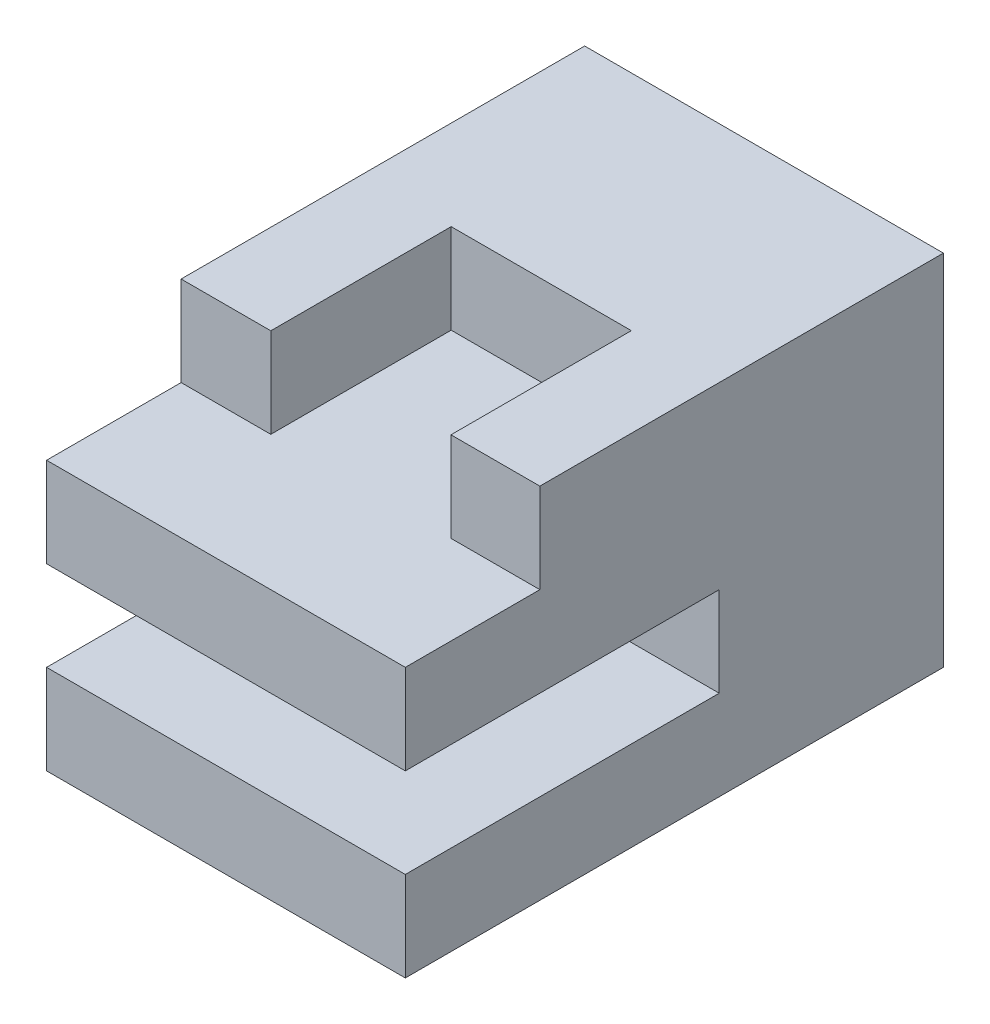
ISO-10303-21;
HEADER;
FILE_DESCRIPTION(('STEP AP214'),'2;1');
FILE_NAME('part.step','',(''),(''),'','','');
FILE_SCHEMA(('AUTOMOTIVE_DESIGN { 1 0 10303 214 1 1 1 1 }'));
ENDSEC;
DATA;
#1=APPLICATION_CONTEXT('core data for automotive mechanical design processes');
#2=APPLICATION_PROTOCOL_DEFINITION('international standard','automotive_design',2000,#1);
#3=PRODUCT_CONTEXT('',#1,'mechanical');
#4=PRODUCT('Part','Part','',(#3));
#5=PRODUCT_RELATED_PRODUCT_CATEGORY('part','',(#4));
#6=PRODUCT_DEFINITION_FORMATION('','',#4);
#7=PRODUCT_DEFINITION_CONTEXT('part definition',#1,'design');
#8=PRODUCT_DEFINITION('design','',#6,#7);
#9=PRODUCT_DEFINITION_SHAPE('','',#8);
#10=(LENGTH_UNIT() NAMED_UNIT(*) SI_UNIT(.MILLI.,.METRE.));
#11=(NAMED_UNIT(*) PLANE_ANGLE_UNIT() SI_UNIT($,.RADIAN.));
#12=(NAMED_UNIT(*) SI_UNIT($,.STERADIAN.) SOLID_ANGLE_UNIT());
#13=UNCERTAINTY_MEASURE_WITH_UNIT(LENGTH_MEASURE(1.E-05),#10,'distance_accuracy_value','');
#14=(GEOMETRIC_REPRESENTATION_CONTEXT(3) GLOBAL_UNCERTAINTY_ASSIGNED_CONTEXT((#13)) GLOBAL_UNIT_ASSIGNED_CONTEXT((#10,
#11,#12)) REPRESENTATION_CONTEXT('',''));
#15=CARTESIAN_POINT('',(0.,0.,0.));
#16=DIRECTION('',(0.,0.,1.));
#17=DIRECTION('',(1.,0.,0.));
#18=AXIS2_PLACEMENT_3D('',#15,#16,#17);
#19=CARTESIAN_POINT('',(0.,0.,45.));
#20=DIRECTION('',(0.,0.,1.));
#21=DIRECTION('',(1.,0.,0.));
#22=AXIS2_PLACEMENT_3D('',#19,#20,#21);
#23=PLANE('',#22);
#24=DIRECTION('',(0.,1.,0.));
#25=VECTOR('',#24,1.);
#26=CARTESIAN_POINT('',(10.,30.,45.));
#27=LINE('',#26,#25);
#28=CARTESIAN_POINT('',(10.,30.,45.));
#29=VERTEX_POINT('',#28);
#30=CARTESIAN_POINT('',(10.,40.,45.));
#31=VERTEX_POINT('',#30);
#32=EDGE_CURVE('E151',#29,#31,#27,.T.);
#33=ORIENTED_EDGE('',*,*,#32,.T.);
#34=DIRECTION('',(-1.,0.,0.));
#35=VECTOR('',#34,1.);
#36=CARTESIAN_POINT('',(0.,40.,45.));
#37=LINE('',#36,#35);
#38=CARTESIAN_POINT('',(0.,40.,45.));
#39=VERTEX_POINT('',#38);
#40=EDGE_CURVE('E168',#31,#39,#37,.T.);
#41=ORIENTED_EDGE('',*,*,#40,.T.);
#42=DIRECTION('',(0.,-1.,0.));
#43=VECTOR('',#42,1.);
#44=CARTESIAN_POINT('',(0.,40.,45.));
#45=LINE('',#44,#43);
#46=CARTESIAN_POINT('',(0.,30.,45.));
#47=VERTEX_POINT('',#46);
#48=EDGE_CURVE('E158',#39,#47,#45,.T.);
#49=ORIENTED_EDGE('',*,*,#48,.T.);
#50=DIRECTION('',(1.,0.,0.));
#51=VECTOR('',#50,1.);
#52=CARTESIAN_POINT('',(0.,30.,45.));
#53=LINE('',#52,#51);
#54=EDGE_CURVE('E157',#47,#29,#53,.T.);
#55=ORIENTED_EDGE('',*,*,#54,.T.);
#56=EDGE_LOOP('',(#33,#41,#49,#55));
#57=FACE_BOUND('',#56,.T.);
#58=ADVANCED_FACE('F33',(#57),#23,.T.);
#59=CARTESIAN_POINT('',(0.,40.,60.));
#60=DIRECTION('',(0.,-1.,0.));
#61=DIRECTION('',(0.,0.,-1.));
#62=AXIS2_PLACEMENT_3D('',#59,#60,#61);
#63=PLANE('',#62);
#64=ORIENTED_EDGE('',*,*,#40,.F.);
#65=DIRECTION('',(0.,0.,1.));
#66=VECTOR('',#65,1.);
#67=CARTESIAN_POINT('',(10.,40.,45.));
#68=LINE('',#67,#66);
#69=CARTESIAN_POINT('',(10.,40.,24.8859484044942));
#70=VERTEX_POINT('',#69);
#71=EDGE_CURVE('E269',#70,#31,#68,.T.);
#72=ORIENTED_EDGE('',*,*,#71,.F.);
#73=DIRECTION('',(-1.,0.,0.));
#74=VECTOR('',#73,1.);
#75=CARTESIAN_POINT('',(10.,40.,24.8859484044942));
#76=LINE('',#75,#74);
#77=CARTESIAN_POINT('',(30.0891984789241,40.,24.8859484044942));
#78=VERTEX_POINT('',#77);
#79=EDGE_CURVE('E271',#78,#70,#76,.T.);
#80=ORIENTED_EDGE('',*,*,#79,.F.);
#81=DIRECTION('',(0.,0.,-1.));
#82=VECTOR('',#81,1.);
#83=CARTESIAN_POINT('',(30.0891984789241,40.,45.));
#84=LINE('',#83,#82);
#85=CARTESIAN_POINT('',(30.0891984789241,40.,45.));
#86=VERTEX_POINT('',#85);
#87=EDGE_CURVE('E273',#86,#78,#84,.T.);
#88=ORIENTED_EDGE('',*,*,#87,.F.);
#89=CARTESIAN_POINT('',(40.,40.,45.));
#90=VERTEX_POINT('',#89);
#91=EDGE_CURVE('E150',#90,#86,#37,.T.);
#92=ORIENTED_EDGE('',*,*,#91,.F.);
#93=DIRECTION('',(0.,0.,-1.));
#94=VECTOR('',#93,1.);
#95=CARTESIAN_POINT('',(40.,40.,60.));
#96=LINE('',#95,#94);
#97=CARTESIAN_POINT('',(40.,40.,0.));
#98=VERTEX_POINT('',#97);
#99=EDGE_CURVE('E222',#90,#98,#96,.T.);
#100=ORIENTED_EDGE('',*,*,#99,.T.);
#101=DIRECTION('',(-1.,0.,0.));
#102=VECTOR('',#101,1.);
#103=CARTESIAN_POINT('',(0.,40.,0.));
#104=LINE('',#103,#102);
#105=CARTESIAN_POINT('',(0.,40.,0.));
#106=VERTEX_POINT('',#105);
#107=EDGE_CURVE('E218',#98,#106,#104,.T.);
#108=ORIENTED_EDGE('',*,*,#107,.T.);
#109=DIRECTION('',(0.,0.,-1.));
#110=VECTOR('',#109,1.);
#111=CARTESIAN_POINT('',(0.,40.,60.));
#112=LINE('',#111,#110);
#113=EDGE_CURVE('E210',#39,#106,#112,.T.);
#114=ORIENTED_EDGE('',*,*,#113,.F.);
#115=EDGE_LOOP('',(#64,#72,#80,#88,#92,#100,#108,#114));
#116=FACE_BOUND('',#115,.T.);
#117=ADVANCED_FACE('F239',(#116),#63,.F.);
#118=CARTESIAN_POINT('',(0.,0.,60.));
#119=DIRECTION('',(0.,0.,-1.));
#120=DIRECTION('',(-1.,0.,0.));
#121=AXIS2_PLACEMENT_3D('',#118,#119,#120);
#122=PLANE('',#121);
#123=DIRECTION('',(0.,1.,0.));
#124=VECTOR('',#123,1.);
#125=CARTESIAN_POINT('',(40.,0.,60.));
#126=LINE('',#125,#124);
#127=CARTESIAN_POINT('',(40.,0.,60.));
#128=VERTEX_POINT('',#127);
#129=CARTESIAN_POINT('',(40.,10.,60.));
#130=VERTEX_POINT('',#129);
#131=EDGE_CURVE('E207',#128,#130,#126,.T.);
#132=ORIENTED_EDGE('',*,*,#131,.T.);
#133=DIRECTION('',(1.,0.,0.));
#134=VECTOR('',#133,1.);
#135=CARTESIAN_POINT('',(0.,10.,60.));
#136=LINE('',#135,#134);
#137=CARTESIAN_POINT('',(0.,10.,60.));
#138=VERTEX_POINT('',#137);
#139=EDGE_CURVE('E179',#138,#130,#136,.T.);
#140=ORIENTED_EDGE('',*,*,#139,.F.);
#141=DIRECTION('',(0.,-1.,0.));
#142=VECTOR('',#141,1.);
#143=CARTESIAN_POINT('',(0.,0.,60.));
#144=LINE('',#143,#142);
#145=CARTESIAN_POINT('',(0.,0.,60.));
#146=VERTEX_POINT('',#145);
#147=EDGE_CURVE('E204',#138,#146,#144,.T.);
#148=ORIENTED_EDGE('',*,*,#147,.T.);
#149=DIRECTION('',(1.,0.,0.));
#150=VECTOR('',#149,1.);
#151=CARTESIAN_POINT('',(0.,0.,60.));
#152=LINE('',#151,#150);
#153=EDGE_CURVE('E203',#146,#128,#152,.T.);
#154=ORIENTED_EDGE('',*,*,#153,.T.);
#155=EDGE_LOOP('',(#132,#140,#148,#154));
#156=FACE_BOUND('',#155,.T.);
#157=ADVANCED_FACE('F261',(#156),#122,.F.);
#158=CARTESIAN_POINT('',(0.,0.,60.));
#159=DIRECTION('',(1.,0.,0.));
#160=DIRECTION('',(0.,0.,-1.));
#161=AXIS2_PLACEMENT_3D('',#158,#159,#160);
#162=PLANE('',#161);
#163=CARTESIAN_POINT('',(0.,30.,60.));
#164=VERTEX_POINT('',#163);
#165=CARTESIAN_POINT('',(0.,20.,60.));
#166=VERTEX_POINT('',#165);
#167=EDGE_CURVE('E201',#164,#166,#144,.T.);
#168=ORIENTED_EDGE('',*,*,#167,.F.);
#169=DIRECTION('',(0.,0.,1.));
#170=VECTOR('',#169,1.);
#171=CARTESIAN_POINT('',(0.,30.,45.));
#172=LINE('',#171,#170);
#173=EDGE_CURVE('E54',#47,#164,#172,.T.);
#174=ORIENTED_EDGE('',*,*,#173,.F.);
#175=ORIENTED_EDGE('',*,*,#48,.F.);
#176=ORIENTED_EDGE('',*,*,#113,.T.);
#177=DIRECTION('',(0.,-1.,0.));
#178=VECTOR('',#177,1.);
#179=CARTESIAN_POINT('',(0.,0.,0.));
#180=LINE('',#179,#178);
#181=CARTESIAN_POINT('',(0.,0.,0.));
#182=VERTEX_POINT('',#181);
#183=EDGE_CURVE('E194',#106,#182,#180,.T.);
#184=ORIENTED_EDGE('',*,*,#183,.T.);
#185=DIRECTION('',(0.,0.,-1.));
#186=VECTOR('',#185,1.);
#187=CARTESIAN_POINT('',(0.,0.,60.));
#188=LINE('',#187,#186);
#189=EDGE_CURVE('E11',#146,#182,#188,.T.);
#190=ORIENTED_EDGE('',*,*,#189,.F.);
#191=ORIENTED_EDGE('',*,*,#147,.F.);
#192=DIRECTION('',(0.,0.,1.));
#193=VECTOR('',#192,1.);
#194=CARTESIAN_POINT('',(0.,10.,25.));
#195=LINE('',#194,#193);
#196=CARTESIAN_POINT('',(0.,10.,25.));
#197=VERTEX_POINT('',#196);
#198=EDGE_CURVE('E195',#197,#138,#195,.T.);
#199=ORIENTED_EDGE('',*,*,#198,.F.);
#200=DIRECTION('',(0.,-1.,0.));
#201=VECTOR('',#200,1.);
#202=CARTESIAN_POINT('',(0.,10.,25.));
#203=LINE('',#202,#201);
#204=CARTESIAN_POINT('',(0.,20.,25.));
#205=VERTEX_POINT('',#204);
#206=EDGE_CURVE('E182',#205,#197,#203,.T.);
#207=ORIENTED_EDGE('',*,*,#206,.F.);
#208=DIRECTION('',(0.,0.,1.));
#209=VECTOR('',#208,1.);
#210=CARTESIAN_POINT('',(0.,20.,25.));
#211=LINE('',#210,#209);
#212=EDGE_CURVE('E197',#205,#166,#211,.T.);
#213=ORIENTED_EDGE('',*,*,#212,.T.);
#214=EDGE_LOOP('',(#168,#174,#175,#176,#184,#190,#191,#199,#207,#213));
#215=FACE_BOUND('',#214,.T.);
#216=ADVANCED_FACE('F35',(#215),#162,.F.);
#217=CARTESIAN_POINT('',(0.,0.,60.));
#218=DIRECTION('',(0.,1.,0.));
#219=DIRECTION('',(0.,0.,1.));
#220=AXIS2_PLACEMENT_3D('',#217,#218,#219);
#221=PLANE('',#220);
#222=DIRECTION('',(1.,0.,0.));
#223=VECTOR('',#222,1.);
#224=CARTESIAN_POINT('',(0.,0.,0.));
#225=LINE('',#224,#223);
#226=CARTESIAN_POINT('',(40.,0.,0.));
#227=VERTEX_POINT('',#226);
#228=EDGE_CURVE('E213',#182,#227,#225,.T.);
#229=ORIENTED_EDGE('',*,*,#228,.T.);
#230=DIRECTION('',(0.,0.,-1.));
#231=VECTOR('',#230,1.);
#232=CARTESIAN_POINT('',(40.,0.,60.));
#233=LINE('',#232,#231);
#234=EDGE_CURVE('E41',#128,#227,#233,.T.);
#235=ORIENTED_EDGE('',*,*,#234,.F.);
#236=ORIENTED_EDGE('',*,*,#153,.F.);
#237=ORIENTED_EDGE('',*,*,#189,.T.);
#238=EDGE_LOOP('',(#229,#235,#236,#237));
#239=FACE_BOUND('',#238,.T.);
#240=ADVANCED_FACE('F263',(#239),#221,.F.);
#241=CARTESIAN_POINT('',(40.,0.,60.));
#242=DIRECTION('',(-1.,0.,0.));
#243=DIRECTION('',(0.,0.,1.));
#244=AXIS2_PLACEMENT_3D('',#241,#242,#243);
#245=PLANE('',#244);
#246=DIRECTION('',(0.,1.,0.));
#247=VECTOR('',#246,1.);
#248=CARTESIAN_POINT('',(40.,40.,45.));
#249=LINE('',#248,#247);
#250=CARTESIAN_POINT('',(40.,30.,45.));
#251=VERTEX_POINT('',#250);
#252=EDGE_CURVE('E161',#251,#90,#249,.T.);
#253=ORIENTED_EDGE('',*,*,#252,.F.);
#254=DIRECTION('',(0.,0.,1.));
#255=VECTOR('',#254,1.);
#256=CARTESIAN_POINT('',(40.,30.,45.));
#257=LINE('',#256,#255);
#258=CARTESIAN_POINT('',(40.,30.,60.));
#259=VERTEX_POINT('',#258);
#260=EDGE_CURVE('E155',#251,#259,#257,.T.);
#261=ORIENTED_EDGE('',*,*,#260,.T.);
#262=CARTESIAN_POINT('',(40.,20.,60.));
#263=VERTEX_POINT('',#262);
#264=EDGE_CURVE('E206',#263,#259,#126,.T.);
#265=ORIENTED_EDGE('',*,*,#264,.F.);
#266=DIRECTION('',(0.,0.,1.));
#267=VECTOR('',#266,1.);
#268=CARTESIAN_POINT('',(40.,20.,25.));
#269=LINE('',#268,#267);
#270=CARTESIAN_POINT('',(40.,20.,25.));
#271=VERTEX_POINT('',#270);
#272=EDGE_CURVE('E187',#271,#263,#269,.T.);
#273=ORIENTED_EDGE('',*,*,#272,.F.);
#274=DIRECTION('',(0.,1.,0.));
#275=VECTOR('',#274,1.);
#276=CARTESIAN_POINT('',(40.,10.,25.));
#277=LINE('',#276,#275);
#278=CARTESIAN_POINT('',(40.,10.,25.));
#279=VERTEX_POINT('',#278);
#280=EDGE_CURVE('E175',#279,#271,#277,.T.);
#281=ORIENTED_EDGE('',*,*,#280,.F.);
#282=DIRECTION('',(0.,0.,1.));
#283=VECTOR('',#282,1.);
#284=CARTESIAN_POINT('',(40.,10.,25.));
#285=LINE('',#284,#283);
#286=EDGE_CURVE('E191',#279,#130,#285,.T.);
#287=ORIENTED_EDGE('',*,*,#286,.T.);
#288=ORIENTED_EDGE('',*,*,#131,.F.);
#289=ORIENTED_EDGE('',*,*,#234,.T.);
#290=DIRECTION('',(0.,1.,0.));
#291=VECTOR('',#290,1.);
#292=CARTESIAN_POINT('',(40.,0.,0.));
#293=LINE('',#292,#291);
#294=EDGE_CURVE('E215',#227,#98,#293,.T.);
#295=ORIENTED_EDGE('',*,*,#294,.T.);
#296=ORIENTED_EDGE('',*,*,#99,.F.);
#297=EDGE_LOOP('',(#253,#261,#265,#273,#281,#287,#288,#289,#295,#296));
#298=FACE_BOUND('',#297,.T.);
#299=ADVANCED_FACE('F228',(#298),#245,.F.);
#300=ORIENTED_EDGE('',*,*,#264,.T.);
#301=DIRECTION('',(1.,0.,0.));
#302=VECTOR('',#301,1.);
#303=CARTESIAN_POINT('',(0.,30.,60.));
#304=LINE('',#303,#302);
#305=EDGE_CURVE('E163',#164,#259,#304,.T.);
#306=ORIENTED_EDGE('',*,*,#305,.F.);
#307=ORIENTED_EDGE('',*,*,#167,.T.);
#308=DIRECTION('',(-1.,0.,0.));
#309=VECTOR('',#308,1.);
#310=CARTESIAN_POINT('',(0.,20.,60.));
#311=LINE('',#310,#309);
#312=EDGE_CURVE('E173',#263,#166,#311,.T.);
#313=ORIENTED_EDGE('',*,*,#312,.F.);
#314=EDGE_LOOP('',(#300,#306,#307,#313));
#315=FACE_BOUND('',#314,.T.);
#316=ADVANCED_FACE('F245',(#315),#122,.F.);
#317=CARTESIAN_POINT('',(0.,0.,0.));
#318=DIRECTION('',(0.,0.,-1.));
#319=DIRECTION('',(-1.,0.,0.));
#320=AXIS2_PLACEMENT_3D('',#317,#318,#319);
#321=PLANE('',#320);
#322=ORIENTED_EDGE('',*,*,#183,.F.);
#323=ORIENTED_EDGE('',*,*,#107,.F.);
#324=ORIENTED_EDGE('',*,*,#294,.F.);
#325=ORIENTED_EDGE('',*,*,#228,.F.);
#326=EDGE_LOOP('',(#322,#323,#324,#325));
#327=FACE_BOUND('',#326,.T.);
#328=ADVANCED_FACE('F235',(#327),#321,.T.);
#329=CARTESIAN_POINT('',(0.,10.,25.));
#330=DIRECTION('',(0.,-1.,0.));
#331=DIRECTION('',(0.,0.,-1.));
#332=AXIS2_PLACEMENT_3D('',#329,#330,#331);
#333=PLANE('',#332);
#334=ORIENTED_EDGE('',*,*,#139,.T.);
#335=ORIENTED_EDGE('',*,*,#286,.F.);
#336=DIRECTION('',(1.,0.,0.));
#337=VECTOR('',#336,1.);
#338=CARTESIAN_POINT('',(0.,10.,25.));
#339=LINE('',#338,#337);
#340=EDGE_CURVE('E184',#197,#279,#339,.T.);
#341=ORIENTED_EDGE('',*,*,#340,.F.);
#342=ORIENTED_EDGE('',*,*,#198,.T.);
#343=EDGE_LOOP('',(#334,#335,#341,#342));
#344=FACE_BOUND('',#343,.T.);
#345=ADVANCED_FACE('F258',(#344),#333,.F.);
#346=CARTESIAN_POINT('',(0.,20.,25.));
#347=DIRECTION('',(0.,1.,0.));
#348=DIRECTION('',(0.,0.,1.));
#349=AXIS2_PLACEMENT_3D('',#346,#347,#348);
#350=PLANE('',#349);
#351=ORIENTED_EDGE('',*,*,#312,.T.);
#352=ORIENTED_EDGE('',*,*,#212,.F.);
#353=DIRECTION('',(-1.,0.,0.));
#354=VECTOR('',#353,1.);
#355=CARTESIAN_POINT('',(0.,20.,25.));
#356=LINE('',#355,#354);
#357=EDGE_CURVE('E178',#271,#205,#356,.T.);
#358=ORIENTED_EDGE('',*,*,#357,.F.);
#359=ORIENTED_EDGE('',*,*,#272,.T.);
#360=EDGE_LOOP('',(#351,#352,#358,#359));
#361=FACE_BOUND('',#360,.T.);
#362=ADVANCED_FACE('F248',(#361),#350,.F.);
#363=CARTESIAN_POINT('',(0.,0.,25.));
#364=DIRECTION('',(0.,0.,-1.));
#365=DIRECTION('',(-1.,0.,0.));
#366=AXIS2_PLACEMENT_3D('',#363,#364,#365);
#367=PLANE('',#366);
#368=ORIENTED_EDGE('',*,*,#280,.T.);
#369=ORIENTED_EDGE('',*,*,#357,.T.);
#370=ORIENTED_EDGE('',*,*,#206,.T.);
#371=ORIENTED_EDGE('',*,*,#340,.T.);
#372=EDGE_LOOP('',(#368,#369,#370,#371));
#373=FACE_BOUND('',#372,.T.);
#374=ADVANCED_FACE('F255',(#373),#367,.F.);
#375=CARTESIAN_POINT('',(0.,30.,45.));
#376=DIRECTION('',(0.,-1.,0.));
#377=DIRECTION('',(0.,0.,-1.));
#378=AXIS2_PLACEMENT_3D('',#375,#376,#377);
#379=PLANE('',#378);
#380=ORIENTED_EDGE('',*,*,#305,.T.);
#381=ORIENTED_EDGE('',*,*,#260,.F.);
#382=CARTESIAN_POINT('',(30.0891984789241,30.,45.));
#383=VERTEX_POINT('',#382);
#384=EDGE_CURVE('E147',#383,#251,#53,.T.);
#385=ORIENTED_EDGE('',*,*,#384,.F.);
#386=DIRECTION('',(0.,0.,-1.));
#387=VECTOR('',#386,1.);
#388=CARTESIAN_POINT('',(30.0891984789241,30.,45.));
#389=LINE('',#388,#387);
#390=CARTESIAN_POINT('',(30.0891984789241,30.,24.8859484044942));
#391=VERTEX_POINT('',#390);
#392=EDGE_CURVE('E133',#383,#391,#389,.T.);
#393=ORIENTED_EDGE('',*,*,#392,.T.);
#394=DIRECTION('',(-1.,0.,0.));
#395=VECTOR('',#394,1.);
#396=CARTESIAN_POINT('',(10.,30.,24.8859484044942));
#397=LINE('',#396,#395);
#398=CARTESIAN_POINT('',(10.,30.,24.8859484044942));
#399=VERTEX_POINT('',#398);
#400=EDGE_CURVE('E142',#391,#399,#397,.T.);
#401=ORIENTED_EDGE('',*,*,#400,.T.);
#402=DIRECTION('',(0.,0.,1.));
#403=VECTOR('',#402,1.);
#404=CARTESIAN_POINT('',(10.,30.,45.));
#405=LINE('',#404,#403);
#406=EDGE_CURVE('E48',#399,#29,#405,.T.);
#407=ORIENTED_EDGE('',*,*,#406,.T.);
#408=ORIENTED_EDGE('',*,*,#54,.F.);
#409=ORIENTED_EDGE('',*,*,#173,.T.);
#410=EDGE_LOOP('',(#380,#381,#385,#393,#401,#407,#408,#409));
#411=FACE_BOUND('',#410,.T.);
#412=ADVANCED_FACE('F153',(#411),#379,.F.);
#413=DIRECTION('',(0.,1.,0.));
#414=VECTOR('',#413,1.);
#415=CARTESIAN_POINT('',(30.0891984789241,30.,45.));
#416=LINE('',#415,#414);
#417=EDGE_CURVE('E137',#383,#86,#416,.T.);
#418=ORIENTED_EDGE('',*,*,#417,.F.);
#419=ORIENTED_EDGE('',*,*,#384,.T.);
#420=ORIENTED_EDGE('',*,*,#252,.T.);
#421=ORIENTED_EDGE('',*,*,#91,.T.);
#422=EDGE_LOOP('',(#418,#419,#420,#421));
#423=FACE_BOUND('',#422,.T.);
#424=ADVANCED_FACE('F146',(#423),#23,.T.);
#425=CARTESIAN_POINT('',(10.,30.,45.));
#426=DIRECTION('',(-1.,0.,0.));
#427=DIRECTION('',(0.,0.,1.));
#428=AXIS2_PLACEMENT_3D('',#425,#426,#427);
#429=PLANE('',#428);
#430=ORIENTED_EDGE('',*,*,#71,.T.);
#431=ORIENTED_EDGE('',*,*,#32,.F.);
#432=ORIENTED_EDGE('',*,*,#406,.F.);
#433=DIRECTION('',(0.,1.,0.));
#434=VECTOR('',#433,1.);
#435=CARTESIAN_POINT('',(10.,30.,24.8859484044942));
#436=LINE('',#435,#434);
#437=EDGE_CURVE('E171',#399,#70,#436,.T.);
#438=ORIENTED_EDGE('',*,*,#437,.T.);
#439=EDGE_LOOP('',(#430,#431,#432,#438));
#440=FACE_BOUND('',#439,.T.);
#441=ADVANCED_FACE('F282',(#440),#429,.F.);
#442=CARTESIAN_POINT('',(10.,30.,24.8859484044942));
#443=DIRECTION('',(0.,0.,-1.));
#444=DIRECTION('',(-1.,0.,0.));
#445=AXIS2_PLACEMENT_3D('',#442,#443,#444);
#446=PLANE('',#445);
#447=ORIENTED_EDGE('',*,*,#79,.T.);
#448=ORIENTED_EDGE('',*,*,#437,.F.);
#449=ORIENTED_EDGE('',*,*,#400,.F.);
#450=DIRECTION('',(0.,1.,0.));
#451=VECTOR('',#450,1.);
#452=CARTESIAN_POINT('',(30.0891984789241,30.,24.8859484044942));
#453=LINE('',#452,#451);
#454=EDGE_CURVE('E139',#391,#78,#453,.T.);
#455=ORIENTED_EDGE('',*,*,#454,.T.);
#456=EDGE_LOOP('',(#447,#448,#449,#455));
#457=FACE_BOUND('',#456,.T.);
#458=ADVANCED_FACE('F281',(#457),#446,.F.);
#459=CARTESIAN_POINT('',(30.0891984789241,30.,45.));
#460=DIRECTION('',(1.,0.,0.));
#461=DIRECTION('',(0.,0.,-1.));
#462=AXIS2_PLACEMENT_3D('',#459,#460,#461);
#463=PLANE('',#462);
#464=ORIENTED_EDGE('',*,*,#87,.T.);
#465=ORIENTED_EDGE('',*,*,#454,.F.);
#466=ORIENTED_EDGE('',*,*,#392,.F.);
#467=ORIENTED_EDGE('',*,*,#417,.T.);
#468=EDGE_LOOP('',(#464,#465,#466,#467));
#469=FACE_BOUND('',#468,.T.);
#470=ADVANCED_FACE('F136',(#469),#463,.F.);
#471=CLOSED_SHELL('',(#58,#117,#157,#216,#240,#299,#316,#328,#345,#362,#374,#412,#424,#441,#458,#470));
#472=MANIFOLD_SOLID_BREP('B2',#471);
#473=ADVANCED_BREP_SHAPE_REPRESENTATION('',(#18,#472),#14);
#474=SHAPE_DEFINITION_REPRESENTATION(#9,#473);
ENDSEC;
END-ISO-10303-21;
